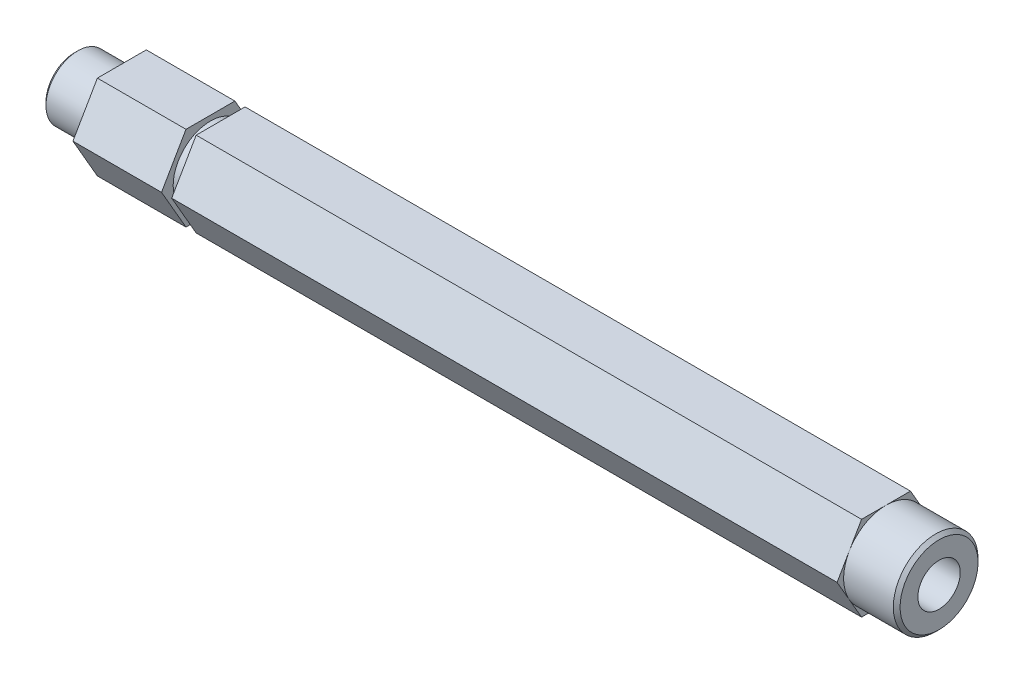
ISO-10303-21;
HEADER;
FILE_DESCRIPTION(('STEP AP214'),'2;1');
FILE_NAME('part.step','',(''),(''),'','','');
FILE_SCHEMA(('AUTOMOTIVE_DESIGN { 1 0 10303 214 1 1 1 1 }'));
ENDSEC;
DATA;
#1=APPLICATION_CONTEXT('core data for automotive mechanical design processes');
#2=APPLICATION_PROTOCOL_DEFINITION('international standard','automotive_design',2000,#1);
#3=PRODUCT_CONTEXT('',#1,'mechanical');
#4=PRODUCT('Part','Part','',(#3));
#5=PRODUCT_RELATED_PRODUCT_CATEGORY('part','',(#4));
#6=PRODUCT_DEFINITION_FORMATION('','',#4);
#7=PRODUCT_DEFINITION_CONTEXT('part definition',#1,'design');
#8=PRODUCT_DEFINITION('design','',#6,#7);
#9=PRODUCT_DEFINITION_SHAPE('','',#8);
#10=(LENGTH_UNIT() NAMED_UNIT(*) SI_UNIT(.MILLI.,.METRE.));
#11=(NAMED_UNIT(*) PLANE_ANGLE_UNIT() SI_UNIT($,.RADIAN.));
#12=(NAMED_UNIT(*) SI_UNIT($,.STERADIAN.) SOLID_ANGLE_UNIT());
#13=UNCERTAINTY_MEASURE_WITH_UNIT(LENGTH_MEASURE(1.E-05),#10,'distance_accuracy_value','');
#14=(GEOMETRIC_REPRESENTATION_CONTEXT(3) GLOBAL_UNCERTAINTY_ASSIGNED_CONTEXT((#13)) GLOBAL_UNIT_ASSIGNED_CONTEXT((#10,
#11,#12)) REPRESENTATION_CONTEXT('',''));
#15=CARTESIAN_POINT('',(0.,0.,0.));
#16=DIRECTION('',(0.,0.,1.));
#17=DIRECTION('',(1.,0.,0.));
#18=AXIS2_PLACEMENT_3D('',#15,#16,#17);
#19=CARTESIAN_POINT('',(-75.5502960638859,27.3174302940638,391.529415609775));
#20=DIRECTION('',(1.,0.,0.));
#21=DIRECTION('',(0.,-1.,0.));
#22=AXIS2_PLACEMENT_3D('',#19,#20,#21);
#23=PLANE('',#22);
#24=CARTESIAN_POINT('',(-75.5502960638859,27.3174302940638,391.529415609775));
#25=DIRECTION('',(1.,0.,0.));
#26=DIRECTION('',(0.,0.,1.));
#27=AXIS2_PLACEMENT_3D('',#24,#25,#26);
#28=CIRCLE('',#27,6.35);
#29=CARTESIAN_POINT('',(-75.5502960638859,24.1424302940638,397.028676923806));
#30=VERTEX_POINT('',#29);
#31=CARTESIAN_POINT('',(-75.5502960638859,20.9674302940638,391.529415609775));
#32=VERTEX_POINT('',#31);
#33=EDGE_CURVE('E447',#30,#32,#28,.T.);
#34=ORIENTED_EDGE('',*,*,#33,.F.);
#35=DIRECTION('',(0.,-0.866025403784439,-0.5));
#36=VECTOR('',#35,1.);
#37=CARTESIAN_POINT('',(-75.5502960638859,24.1424302940638,397.028676923806));
#38=LINE('',#37,#36);
#39=CARTESIAN_POINT('',(-75.5502960638859,20.9674302940638,395.195589819129));
#40=VERTEX_POINT('',#39);
#41=EDGE_CURVE('E266',#30,#40,#38,.T.);
#42=ORIENTED_EDGE('',*,*,#41,.T.);
#43=DIRECTION('',(0.,0.,-1.));
#44=VECTOR('',#43,1.);
#45=CARTESIAN_POINT('',(-75.5502960638859,20.9674302940638,391.529415609775));
#46=LINE('',#45,#44);
#47=EDGE_CURVE('E255',#40,#32,#46,.T.);
#48=ORIENTED_EDGE('',*,*,#47,.T.);
#49=EDGE_LOOP('',(#34,#42,#48));
#50=FACE_BOUND('',#49,.T.);
#51=ADVANCED_FACE('F17',(#50),#23,.T.);
#52=CARTESIAN_POINT('',(-75.5502960638859,27.3174302940638,391.529415609775));
#53=DIRECTION('',(1.,0.,0.));
#54=DIRECTION('',(0.,-1.,0.));
#55=AXIS2_PLACEMENT_3D('',#52,#53,#54);
#56=PLANE('',#55);
#57=CARTESIAN_POINT('',(-75.5502960638859,27.3174302940638,391.529415609775));
#58=DIRECTION('',(1.,0.,0.));
#59=DIRECTION('',(0.,0.,1.));
#60=AXIS2_PLACEMENT_3D('',#57,#58,#59);
#61=CIRCLE('',#60,6.35);
#62=CARTESIAN_POINT('',(-75.5502960638859,24.1424302940638,386.030154295744));
#63=VERTEX_POINT('',#62);
#64=EDGE_CURVE('E428',#32,#63,#61,.T.);
#65=ORIENTED_EDGE('',*,*,#64,.F.);
#66=DIRECTION('',(0.,0.,-1.));
#67=VECTOR('',#66,1.);
#68=CARTESIAN_POINT('',(-75.5502960638859,20.9674302940638,391.529415609775));
#69=LINE('',#68,#67);
#70=CARTESIAN_POINT('',(-75.5502960638859,20.9674302940638,387.863241400421));
#71=VERTEX_POINT('',#70);
#72=EDGE_CURVE('E252',#32,#71,#69,.T.);
#73=ORIENTED_EDGE('',*,*,#72,.T.);
#74=DIRECTION('',(0.,0.866025403784438,-0.5));
#75=VECTOR('',#74,1.);
#76=CARTESIAN_POINT('',(-75.5502960638859,24.1424302940638,386.030154295744));
#77=LINE('',#76,#75);
#78=EDGE_CURVE('E244',#71,#63,#77,.T.);
#79=ORIENTED_EDGE('',*,*,#78,.T.);
#80=EDGE_LOOP('',(#65,#73,#79));
#81=FACE_BOUND('',#80,.T.);
#82=ADVANCED_FACE('F19',(#81),#56,.T.);
#83=CARTESIAN_POINT('',(-75.5502960638859,27.3174302940638,391.529415609775));
#84=DIRECTION('',(1.,0.,0.));
#85=DIRECTION('',(0.,-1.,0.));
#86=AXIS2_PLACEMENT_3D('',#83,#84,#85);
#87=PLANE('',#86);
#88=CARTESIAN_POINT('',(-75.5502960638859,27.3174302940638,391.529415609775));
#89=DIRECTION('',(1.,0.,0.));
#90=DIRECTION('',(0.,0.,1.));
#91=AXIS2_PLACEMENT_3D('',#88,#89,#90);
#92=CIRCLE('',#91,6.35);
#93=CARTESIAN_POINT('',(-75.5502960638858,30.4924302940638,386.030154295744));
#94=VERTEX_POINT('',#93);
#95=EDGE_CURVE('E425',#63,#94,#92,.T.);
#96=ORIENTED_EDGE('',*,*,#95,.F.);
#97=DIRECTION('',(0.,0.866025403784438,-0.5));
#98=VECTOR('',#97,1.);
#99=CARTESIAN_POINT('',(-75.5502960638859,24.1424302940638,386.030154295744));
#100=LINE('',#99,#98);
#101=CARTESIAN_POINT('',(-75.5502960638859,27.3174302940638,384.197067191066));
#102=VERTEX_POINT('',#101);
#103=EDGE_CURVE('E242',#63,#102,#100,.T.);
#104=ORIENTED_EDGE('',*,*,#103,.T.);
#105=DIRECTION('',(0.,0.866025403784439,0.5));
#106=VECTOR('',#105,1.);
#107=CARTESIAN_POINT('',(-75.5502960638858,30.4924302940638,386.030154295744));
#108=LINE('',#107,#106);
#109=EDGE_CURVE('E371',#102,#94,#108,.T.);
#110=ORIENTED_EDGE('',*,*,#109,.T.);
#111=EDGE_LOOP('',(#96,#104,#110));
#112=FACE_BOUND('',#111,.T.);
#113=ADVANCED_FACE('F507',(#112),#87,.T.);
#114=CARTESIAN_POINT('',(-75.5502960638859,27.3174302940638,391.529415609775));
#115=DIRECTION('',(1.,0.,0.));
#116=DIRECTION('',(0.,-1.,0.));
#117=AXIS2_PLACEMENT_3D('',#114,#115,#116);
#118=PLANE('',#117);
#119=CARTESIAN_POINT('',(-75.5502960638859,27.3174302940638,391.529415609775));
#120=DIRECTION('',(1.,0.,0.));
#121=DIRECTION('',(0.,0.,1.));
#122=AXIS2_PLACEMENT_3D('',#119,#120,#121);
#123=CIRCLE('',#122,6.35);
#124=CARTESIAN_POINT('',(-75.5502960638858,33.6674302940638,391.529415609775));
#125=VERTEX_POINT('',#124);
#126=EDGE_CURVE('E407',#94,#125,#123,.T.);
#127=ORIENTED_EDGE('',*,*,#126,.F.);
#128=DIRECTION('',(0.,0.866025403784439,0.5));
#129=VECTOR('',#128,1.);
#130=CARTESIAN_POINT('',(-75.5502960638858,30.4924302940638,386.030154295744));
#131=LINE('',#130,#129);
#132=CARTESIAN_POINT('',(-75.5502960638858,33.6674302940638,387.863241400421));
#133=VERTEX_POINT('',#132);
#134=EDGE_CURVE('E370',#94,#133,#131,.T.);
#135=ORIENTED_EDGE('',*,*,#134,.T.);
#136=DIRECTION('',(0.,0.,1.));
#137=VECTOR('',#136,1.);
#138=CARTESIAN_POINT('',(-75.5502960638858,33.6674302940638,391.529415609775));
#139=LINE('',#138,#137);
#140=EDGE_CURVE('E352',#133,#125,#139,.T.);
#141=ORIENTED_EDGE('',*,*,#140,.T.);
#142=EDGE_LOOP('',(#127,#135,#141));
#143=FACE_BOUND('',#142,.T.);
#144=ADVANCED_FACE('F405',(#143),#118,.T.);
#145=CARTESIAN_POINT('',(-75.5502960638859,27.3174302940638,391.529415609775));
#146=DIRECTION('',(1.,0.,0.));
#147=DIRECTION('',(0.,-1.,0.));
#148=AXIS2_PLACEMENT_3D('',#145,#146,#147);
#149=PLANE('',#148);
#150=CARTESIAN_POINT('',(-75.5502960638859,27.3174302940638,391.529415609775));
#151=DIRECTION('',(1.,0.,0.));
#152=DIRECTION('',(0.,0.,1.));
#153=AXIS2_PLACEMENT_3D('',#150,#151,#152);
#154=CIRCLE('',#153,6.35);
#155=CARTESIAN_POINT('',(-75.5502960638858,30.4924302940639,397.028676923806));
#156=VERTEX_POINT('',#155);
#157=EDGE_CURVE('E430',#125,#156,#154,.T.);
#158=ORIENTED_EDGE('',*,*,#157,.F.);
#159=DIRECTION('',(0.,0.,1.));
#160=VECTOR('',#159,1.);
#161=CARTESIAN_POINT('',(-75.5502960638858,33.6674302940638,391.529415609775));
#162=LINE('',#161,#160);
#163=CARTESIAN_POINT('',(-75.5502960638858,33.6674302940638,395.195589819129));
#164=VERTEX_POINT('',#163);
#165=EDGE_CURVE('E362',#125,#164,#162,.T.);
#166=ORIENTED_EDGE('',*,*,#165,.T.);
#167=DIRECTION('',(0.,-0.866025403784438,0.5));
#168=VECTOR('',#167,1.);
#169=CARTESIAN_POINT('',(-75.5502960638858,30.4924302940639,397.028676923806));
#170=LINE('',#169,#168);
#171=EDGE_CURVE('E276',#164,#156,#170,.T.);
#172=ORIENTED_EDGE('',*,*,#171,.T.);
#173=EDGE_LOOP('',(#158,#166,#172));
#174=FACE_BOUND('',#173,.T.);
#175=ADVANCED_FACE('F568',(#174),#149,.T.);
#176=CARTESIAN_POINT('',(-176.820096063886,27.3174302940641,391.529415609775));
#177=DIRECTION('',(1.,0.,0.));
#178=DIRECTION('',(0.,-1.,0.));
#179=AXIS2_PLACEMENT_3D('',#176,#177,#178);
#180=PLANE('',#179);
#181=DIRECTION('',(0.,-0.866025403784438,0.5));
#182=VECTOR('',#181,1.);
#183=CARTESIAN_POINT('',(-176.820096063886,33.667430294064,395.195589819129));
#184=LINE('',#183,#182);
#185=CARTESIAN_POINT('',(-176.820096063886,33.667430294064,395.195589819129));
#186=VERTEX_POINT('',#185);
#187=CARTESIAN_POINT('',(-176.820096063886,27.3174302940641,398.861764028484));
#188=VERTEX_POINT('',#187);
#189=EDGE_CURVE('E26',#186,#188,#184,.T.);
#190=ORIENTED_EDGE('',*,*,#189,.T.);
#191=DIRECTION('',(0.,-0.866025403784439,-0.5));
#192=VECTOR('',#191,1.);
#193=CARTESIAN_POINT('',(-176.820096063886,27.3174302940641,398.861764028484));
#194=LINE('',#193,#192);
#195=CARTESIAN_POINT('',(-176.820096063886,20.967430294064,395.195589819129));
#196=VERTEX_POINT('',#195);
#197=EDGE_CURVE('E205',#188,#196,#194,.T.);
#198=ORIENTED_EDGE('',*,*,#197,.T.);
#199=DIRECTION('',(0.,0.,-1.));
#200=VECTOR('',#199,1.);
#201=CARTESIAN_POINT('',(-176.820096063886,20.967430294064,395.195589819129));
#202=LINE('',#201,#200);
#203=CARTESIAN_POINT('',(-176.820096063886,20.967430294064,387.863241400421));
#204=VERTEX_POINT('',#203);
#205=EDGE_CURVE('E210',#196,#204,#202,.T.);
#206=ORIENTED_EDGE('',*,*,#205,.T.);
#207=DIRECTION('',(0.,0.866025403784438,-0.5));
#208=VECTOR('',#207,1.);
#209=CARTESIAN_POINT('',(-176.820096063886,20.967430294064,387.863241400421));
#210=LINE('',#209,#208);
#211=CARTESIAN_POINT('',(-176.820096063886,27.317430294064,384.197067191067));
#212=VERTEX_POINT('',#211);
#213=EDGE_CURVE('E313',#204,#212,#210,.T.);
#214=ORIENTED_EDGE('',*,*,#213,.T.);
#215=DIRECTION('',(0.,0.866025403784439,0.5));
#216=VECTOR('',#215,1.);
#217=CARTESIAN_POINT('',(-176.820096063886,27.317430294064,384.197067191067));
#218=LINE('',#217,#216);
#219=CARTESIAN_POINT('',(-176.820096063886,33.667430294064,387.863241400421));
#220=VERTEX_POINT('',#219);
#221=EDGE_CURVE('E303',#212,#220,#218,.T.);
#222=ORIENTED_EDGE('',*,*,#221,.T.);
#223=DIRECTION('',(0.,0.,1.));
#224=VECTOR('',#223,1.);
#225=CARTESIAN_POINT('',(-176.820096063886,33.667430294064,387.863241400421));
#226=LINE('',#225,#224);
#227=EDGE_CURVE('E295',#220,#186,#226,.T.);
#228=ORIENTED_EDGE('',*,*,#227,.T.);
#229=EDGE_LOOP('',(#190,#198,#206,#214,#222,#228));
#230=FACE_BOUND('',#229,.T.);
#231=CARTESIAN_POINT('',(-176.820096063886,27.3174302940641,391.529415609775));
#232=DIRECTION('',(1.,0.,0.));
#233=DIRECTION('',(0.,0.,1.));
#234=AXIS2_PLACEMENT_3D('',#231,#232,#233);
#235=CIRCLE('',#234,5.588);
#236=CARTESIAN_POINT('',(-176.820096063886,27.3174302940641,397.117415609775));
#237=VERTEX_POINT('',#236);
#238=EDGE_CURVE('E282',#237,#237,#235,.T.);
#239=ORIENTED_EDGE('',*,*,#238,.F.);
#240=EDGE_LOOP('',(#239));
#241=FACE_BOUND('',#240,.T.);
#242=ADVANCED_FACE('F207',(#230,#241),#180,.T.);
#243=CARTESIAN_POINT('',(-190.104296063886,27.3174302940641,391.529415609775));
#244=DIRECTION('',(-1.,0.,0.));
#245=DIRECTION('',(0.,0.,-1.));
#246=AXIS2_PLACEMENT_3D('',#243,#244,#245);
#247=CYLINDRICAL_SURFACE('',#246,4.7625);
#248=CARTESIAN_POINT('',(-196.708296063886,27.3174302940641,391.529415609775));
#249=DIRECTION('',(1.,0.,0.));
#250=DIRECTION('',(0.,0.,1.));
#251=AXIS2_PLACEMENT_3D('',#248,#249,#250);
#252=CIRCLE('',#251,4.7625);
#253=CARTESIAN_POINT('',(-196.708296063886,27.3174302940641,396.291915609775));
#254=VERTEX_POINT('',#253);
#255=EDGE_CURVE('E589',#254,#254,#252,.T.);
#256=ORIENTED_EDGE('',*,*,#255,.T.);
#257=EDGE_LOOP('',(#256));
#258=FACE_BOUND('',#257,.T.);
#259=CARTESIAN_POINT('',(-190.104296063886,27.3174302940641,391.529415609775));
#260=DIRECTION('',(1.,0.,0.));
#261=DIRECTION('',(0.,0.,1.));
#262=AXIS2_PLACEMENT_3D('',#259,#260,#261);
#263=CIRCLE('',#262,4.7625);
#264=CARTESIAN_POINT('',(-190.104296063886,27.3174302940641,396.291915609775));
#265=VERTEX_POINT('',#264);
#266=EDGE_CURVE('E11',#265,#265,#263,.T.);
#267=ORIENTED_EDGE('',*,*,#266,.F.);
#268=EDGE_LOOP('',(#267));
#269=FACE_BOUND('',#268,.T.);
#270=ADVANCED_FACE('F557',(#258,#269),#247,.T.);
#271=CARTESIAN_POINT('',(-197.216296063886,27.3174302940641,391.529415609775));
#272=DIRECTION('',(1.,0.,0.));
#273=DIRECTION('',(0.,-1.,0.));
#274=AXIS2_PLACEMENT_3D('',#271,#272,#273);
#275=PLANE('',#274);
#276=CARTESIAN_POINT('',(-197.216296063886,27.3174302940641,391.529415609775));
#277=DIRECTION('',(-1.,0.,0.));
#278=DIRECTION('',(0.,0.,1.));
#279=AXIS2_PLACEMENT_3D('',#276,#277,#278);
#280=CIRCLE('',#279,4.2545);
#281=CARTESIAN_POINT('',(-197.216296063886,27.3174302940641,395.783915609775));
#282=VERTEX_POINT('',#281);
#283=EDGE_CURVE('E585',#282,#282,#280,.T.);
#284=ORIENTED_EDGE('',*,*,#283,.T.);
#285=EDGE_LOOP('',(#284));
#286=FACE_BOUND('',#285,.T.);
#287=CARTESIAN_POINT('',(-197.216296063886,27.3174302940641,391.529415609775));
#288=DIRECTION('',(-1.,0.,0.));
#289=DIRECTION('',(0.,0.,-1.));
#290=AXIS2_PLACEMENT_3D('',#287,#288,#289);
#291=CIRCLE('',#290,3.175);
#292=CARTESIAN_POINT('',(-197.216296063886,27.3174302940641,388.354415609775));
#293=VERTEX_POINT('',#292);
#294=EDGE_CURVE('E421',#293,#293,#291,.T.);
#295=ORIENTED_EDGE('',*,*,#294,.F.);
#296=EDGE_LOOP('',(#295));
#297=FACE_BOUND('',#296,.T.);
#298=ADVANCED_FACE('F554',(#286,#297),#275,.F.);
#299=CARTESIAN_POINT('',(-190.104296063886,27.3174302940641,391.529415609775));
#300=DIRECTION('',(1.,0.,0.));
#301=DIRECTION('',(0.,-1.,0.));
#302=AXIS2_PLACEMENT_3D('',#299,#300,#301);
#303=PLANE('',#302);
#304=DIRECTION('',(0.,-0.866025403784438,0.5));
#305=VECTOR('',#304,1.);
#306=CARTESIAN_POINT('',(-190.104296063886,33.6674302940641,395.195589819129));
#307=LINE('',#306,#305);
#308=CARTESIAN_POINT('',(-190.104296063886,33.6674302940641,395.195589819129));
#309=VERTEX_POINT('',#308);
#310=CARTESIAN_POINT('',(-190.104296063886,27.3174302940641,398.861764028484));
#311=VERTEX_POINT('',#310);
#312=EDGE_CURVE('E258',#309,#311,#307,.T.);
#313=ORIENTED_EDGE('',*,*,#312,.F.);
#314=DIRECTION('',(0.,0.,1.));
#315=VECTOR('',#314,1.);
#316=CARTESIAN_POINT('',(-190.104296063886,33.667430294064,387.863241400421));
#317=LINE('',#316,#315);
#318=CARTESIAN_POINT('',(-190.104296063886,33.667430294064,387.863241400421));
#319=VERTEX_POINT('',#318);
#320=EDGE_CURVE('E287',#319,#309,#317,.T.);
#321=ORIENTED_EDGE('',*,*,#320,.F.);
#322=DIRECTION('',(0.,0.866025403784439,0.5));
#323=VECTOR('',#322,1.);
#324=CARTESIAN_POINT('',(-190.104296063886,27.3174302940641,384.197067191067));
#325=LINE('',#324,#323);
#326=CARTESIAN_POINT('',(-190.104296063886,27.3174302940641,384.197067191067));
#327=VERTEX_POINT('',#326);
#328=EDGE_CURVE('E302',#327,#319,#325,.T.);
#329=ORIENTED_EDGE('',*,*,#328,.F.);
#330=DIRECTION('',(0.,0.866025403784438,-0.5));
#331=VECTOR('',#330,1.);
#332=CARTESIAN_POINT('',(-190.104296063886,20.967430294064,387.863241400421));
#333=LINE('',#332,#331);
#334=CARTESIAN_POINT('',(-190.104296063886,20.967430294064,387.863241400421));
#335=VERTEX_POINT('',#334);
#336=EDGE_CURVE('E310',#335,#327,#333,.T.);
#337=ORIENTED_EDGE('',*,*,#336,.F.);
#338=DIRECTION('',(0.,0.,-1.));
#339=VECTOR('',#338,1.);
#340=CARTESIAN_POINT('',(-190.104296063886,20.9674302940641,395.195589819129));
#341=LINE('',#340,#339);
#342=CARTESIAN_POINT('',(-190.104296063886,20.9674302940641,395.195589819129));
#343=VERTEX_POINT('',#342);
#344=EDGE_CURVE('E231',#343,#335,#341,.T.);
#345=ORIENTED_EDGE('',*,*,#344,.F.);
#346=DIRECTION('',(0.,-0.866025403784439,-0.5));
#347=VECTOR('',#346,1.);
#348=CARTESIAN_POINT('',(-190.104296063886,27.3174302940641,398.861764028484));
#349=LINE('',#348,#347);
#350=EDGE_CURVE('E216',#311,#343,#349,.T.);
#351=ORIENTED_EDGE('',*,*,#350,.F.);
#352=EDGE_LOOP('',(#313,#321,#329,#337,#345,#351));
#353=FACE_BOUND('',#352,.T.);
#354=ORIENTED_EDGE('',*,*,#266,.T.);
#355=EDGE_LOOP('',(#354));
#356=FACE_BOUND('',#355,.T.);
#357=ADVANCED_FACE('F326',(#353,#356),#303,.F.);
#358=CARTESIAN_POINT('',(-176.820096063886,33.667430294064,395.195589819129));
#359=DIRECTION('',(0.,-0.5,-0.866025403784438));
#360=DIRECTION('',(0.,-0.866025403784438,0.5));
#361=AXIS2_PLACEMENT_3D('',#358,#359,#360);
#362=PLANE('',#361);
#363=ORIENTED_EDGE('',*,*,#312,.T.);
#364=DIRECTION('',(-1.,0.,0.));
#365=VECTOR('',#364,1.);
#366=CARTESIAN_POINT('',(-176.820096063886,27.3174302940641,398.861764028484));
#367=LINE('',#366,#365);
#368=EDGE_CURVE('E215',#188,#311,#367,.T.);
#369=ORIENTED_EDGE('',*,*,#368,.F.);
#370=ORIENTED_EDGE('',*,*,#189,.F.);
#371=DIRECTION('',(-1.,0.,0.));
#372=VECTOR('',#371,1.);
#373=CARTESIAN_POINT('',(-176.820096063886,33.667430294064,395.195589819129));
#374=LINE('',#373,#372);
#375=EDGE_CURVE('E291',#186,#309,#374,.T.);
#376=ORIENTED_EDGE('',*,*,#375,.T.);
#377=EDGE_LOOP('',(#363,#369,#370,#376));
#378=FACE_BOUND('',#377,.T.);
#379=ADVANCED_FACE('F322',(#378),#362,.F.);
#380=CARTESIAN_POINT('',(-176.820096063886,27.3174302940641,398.861764028484));
#381=DIRECTION('',(0.,0.5,-0.866025403784439));
#382=DIRECTION('',(-1.,0.,0.));
#383=AXIS2_PLACEMENT_3D('',#380,#381,#382);
#384=PLANE('',#383);
#385=ORIENTED_EDGE('',*,*,#350,.T.);
#386=DIRECTION('',(-1.,0.,0.));
#387=VECTOR('',#386,1.);
#388=CARTESIAN_POINT('',(-176.820096063886,20.967430294064,395.195589819129));
#389=LINE('',#388,#387);
#390=EDGE_CURVE('E219',#196,#343,#389,.T.);
#391=ORIENTED_EDGE('',*,*,#390,.F.);
#392=ORIENTED_EDGE('',*,*,#197,.F.);
#393=ORIENTED_EDGE('',*,*,#368,.T.);
#394=EDGE_LOOP('',(#385,#391,#392,#393));
#395=FACE_BOUND('',#394,.T.);
#396=ADVANCED_FACE('F220',(#395),#384,.F.);
#397=CARTESIAN_POINT('',(-176.820096063886,20.967430294064,395.195589819129));
#398=DIRECTION('',(0.,1.,0.));
#399=DIRECTION('',(0.,0.,-1.));
#400=AXIS2_PLACEMENT_3D('',#397,#398,#399);
#401=PLANE('',#400);
#402=ORIENTED_EDGE('',*,*,#344,.T.);
#403=DIRECTION('',(-1.,0.,0.));
#404=VECTOR('',#403,1.);
#405=CARTESIAN_POINT('',(-176.820096063886,20.967430294064,387.863241400421));
#406=LINE('',#405,#404);
#407=EDGE_CURVE('E228',#204,#335,#406,.T.);
#408=ORIENTED_EDGE('',*,*,#407,.F.);
#409=ORIENTED_EDGE('',*,*,#205,.F.);
#410=ORIENTED_EDGE('',*,*,#390,.T.);
#411=EDGE_LOOP('',(#402,#408,#409,#410));
#412=FACE_BOUND('',#411,.T.);
#413=ADVANCED_FACE('F226',(#412),#401,.F.);
#414=CARTESIAN_POINT('',(-176.820096063886,20.967430294064,387.863241400421));
#415=DIRECTION('',(0.,0.5,0.866025403784438));
#416=DIRECTION('',(1.,0.,0.));
#417=AXIS2_PLACEMENT_3D('',#414,#415,#416);
#418=PLANE('',#417);
#419=ORIENTED_EDGE('',*,*,#336,.T.);
#420=DIRECTION('',(-1.,0.,0.));
#421=VECTOR('',#420,1.);
#422=CARTESIAN_POINT('',(-176.820096063886,27.317430294064,384.197067191067));
#423=LINE('',#422,#421);
#424=EDGE_CURVE('E306',#212,#327,#423,.T.);
#425=ORIENTED_EDGE('',*,*,#424,.F.);
#426=ORIENTED_EDGE('',*,*,#213,.F.);
#427=ORIENTED_EDGE('',*,*,#407,.T.);
#428=EDGE_LOOP('',(#419,#425,#426,#427));
#429=FACE_BOUND('',#428,.T.);
#430=ADVANCED_FACE('F330',(#429),#418,.F.);
#431=CARTESIAN_POINT('',(-176.820096063886,27.317430294064,384.197067191067));
#432=DIRECTION('',(0.,-0.5,0.866025403784439));
#433=DIRECTION('',(-1.,0.,0.));
#434=AXIS2_PLACEMENT_3D('',#431,#432,#433);
#435=PLANE('',#434);
#436=ORIENTED_EDGE('',*,*,#328,.T.);
#437=DIRECTION('',(-1.,0.,0.));
#438=VECTOR('',#437,1.);
#439=CARTESIAN_POINT('',(-176.820096063886,33.667430294064,387.863241400421));
#440=LINE('',#439,#438);
#441=EDGE_CURVE('E298',#220,#319,#440,.T.);
#442=ORIENTED_EDGE('',*,*,#441,.F.);
#443=ORIENTED_EDGE('',*,*,#221,.F.);
#444=ORIENTED_EDGE('',*,*,#424,.T.);
#445=EDGE_LOOP('',(#436,#442,#443,#444));
#446=FACE_BOUND('',#445,.T.);
#447=ADVANCED_FACE('F336',(#446),#435,.F.);
#448=CARTESIAN_POINT('',(-176.820096063886,33.667430294064,387.863241400421));
#449=DIRECTION('',(0.,-1.,0.));
#450=DIRECTION('',(-1.,0.,0.));
#451=AXIS2_PLACEMENT_3D('',#448,#449,#450);
#452=PLANE('',#451);
#453=ORIENTED_EDGE('',*,*,#320,.T.);
#454=ORIENTED_EDGE('',*,*,#375,.F.);
#455=ORIENTED_EDGE('',*,*,#227,.F.);
#456=ORIENTED_EDGE('',*,*,#441,.T.);
#457=EDGE_LOOP('',(#453,#454,#455,#456));
#458=FACE_BOUND('',#457,.T.);
#459=ADVANCED_FACE('F338',(#458),#452,.F.);
#460=CARTESIAN_POINT('',(-175.296096063886,27.3174302940641,391.529415609775));
#461=DIRECTION('',(-1.,0.,0.));
#462=DIRECTION('',(0.,0.,-1.));
#463=AXIS2_PLACEMENT_3D('',#460,#461,#462);
#464=CYLINDRICAL_SURFACE('',#463,5.588);
#465=CARTESIAN_POINT('',(-175.296096063886,27.3174302940641,391.529415609775));
#466=DIRECTION('',(1.,0.,0.));
#467=DIRECTION('',(0.,0.,1.));
#468=AXIS2_PLACEMENT_3D('',#465,#466,#467);
#469=CIRCLE('',#468,5.588);
#470=CARTESIAN_POINT('',(-175.296096063886,27.3174302940641,397.117415609775));
#471=VERTEX_POINT('',#470);
#472=EDGE_CURVE('E279',#471,#471,#469,.T.);
#473=ORIENTED_EDGE('',*,*,#472,.F.);
#474=EDGE_LOOP('',(#473));
#475=FACE_BOUND('',#474,.T.);
#476=ORIENTED_EDGE('',*,*,#238,.T.);
#477=EDGE_LOOP('',(#476));
#478=FACE_BOUND('',#477,.T.);
#479=ADVANCED_FACE('F534',(#475,#478),#464,.T.);
#480=CARTESIAN_POINT('',(-175.296096063886,27.3174302940641,391.529415609775));
#481=DIRECTION('',(1.,0.,0.));
#482=DIRECTION('',(0.,-1.,0.));
#483=AXIS2_PLACEMENT_3D('',#480,#481,#482);
#484=PLANE('',#483);
#485=DIRECTION('',(0.,-0.866025403784438,0.5));
#486=VECTOR('',#485,1.);
#487=CARTESIAN_POINT('',(-175.296096063886,33.667430294064,395.195589819129));
#488=LINE('',#487,#486);
#489=CARTESIAN_POINT('',(-175.296096063886,33.667430294064,395.195589819129));
#490=VERTEX_POINT('',#489);
#491=CARTESIAN_POINT('',(-175.296096063886,27.3174302940641,398.861764028484));
#492=VERTEX_POINT('',#491);
#493=EDGE_CURVE('E273',#490,#492,#488,.T.);
#494=ORIENTED_EDGE('',*,*,#493,.F.);
#495=DIRECTION('',(0.,0.,1.));
#496=VECTOR('',#495,1.);
#497=CARTESIAN_POINT('',(-175.296096063886,33.667430294064,387.863241400421));
#498=LINE('',#497,#496);
#499=CARTESIAN_POINT('',(-175.296096063886,33.667430294064,387.863241400421));
#500=VERTEX_POINT('',#499);
#501=EDGE_CURVE('E353',#500,#490,#498,.T.);
#502=ORIENTED_EDGE('',*,*,#501,.F.);
#503=DIRECTION('',(0.,0.866025403784439,0.5));
#504=VECTOR('',#503,1.);
#505=CARTESIAN_POINT('',(-175.296096063886,27.317430294064,384.197067191067));
#506=LINE('',#505,#504);
#507=CARTESIAN_POINT('',(-175.296096063886,27.3174302940641,384.197067191067));
#508=VERTEX_POINT('',#507);
#509=EDGE_CURVE('E351',#508,#500,#506,.T.);
#510=ORIENTED_EDGE('',*,*,#509,.F.);
#511=DIRECTION('',(0.,0.866025403784438,-0.5));
#512=VECTOR('',#511,1.);
#513=CARTESIAN_POINT('',(-175.296096063886,20.967430294064,387.863241400421));
#514=LINE('',#513,#512);
#515=CARTESIAN_POINT('',(-175.296096063886,20.967430294064,387.863241400421));
#516=VERTEX_POINT('',#515);
#517=EDGE_CURVE('E240',#516,#508,#514,.T.);
#518=ORIENTED_EDGE('',*,*,#517,.F.);
#519=DIRECTION('',(0.,0.,-1.));
#520=VECTOR('',#519,1.);
#521=CARTESIAN_POINT('',(-175.296096063886,20.967430294064,395.195589819129));
#522=LINE('',#521,#520);
#523=CARTESIAN_POINT('',(-175.296096063886,20.967430294064,395.195589819129));
#524=VERTEX_POINT('',#523);
#525=EDGE_CURVE('E251',#524,#516,#522,.T.);
#526=ORIENTED_EDGE('',*,*,#525,.F.);
#527=DIRECTION('',(0.,-0.866025403784439,-0.5));
#528=VECTOR('',#527,1.);
#529=CARTESIAN_POINT('',(-175.296096063886,27.3174302940641,398.861764028484));
#530=LINE('',#529,#528);
#531=EDGE_CURVE('E263',#492,#524,#530,.T.);
#532=ORIENTED_EDGE('',*,*,#531,.F.);
#533=EDGE_LOOP('',(#494,#502,#510,#518,#526,#532));
#534=FACE_BOUND('',#533,.T.);
#535=ORIENTED_EDGE('',*,*,#472,.T.);
#536=EDGE_LOOP('',(#535));
#537=FACE_BOUND('',#536,.T.);
#538=ADVANCED_FACE('F390',(#534,#537),#484,.F.);
#539=CARTESIAN_POINT('',(-176.820096063886,33.667430294064,395.195589819129));
#540=DIRECTION('',(0.,-0.5,-0.866025403784438));
#541=DIRECTION('',(0.,-0.866025403784438,0.5));
#542=AXIS2_PLACEMENT_3D('',#539,#540,#541);
#543=PLANE('',#542);
#544=ORIENTED_EDGE('',*,*,#493,.T.);
#545=DIRECTION('',(-1.,0.,0.));
#546=VECTOR('',#545,1.);
#547=CARTESIAN_POINT('',(-176.820096063886,27.3174302940641,398.861764028484));
#548=LINE('',#547,#546);
#549=CARTESIAN_POINT('',(-75.5502960638858,27.3174302940638,398.861764028483));
#550=VERTEX_POINT('',#549);
#551=EDGE_CURVE('E269',#550,#492,#548,.T.);
#552=ORIENTED_EDGE('',*,*,#551,.F.);
#553=DIRECTION('',(0.,-0.866025403784438,0.5));
#554=VECTOR('',#553,1.);
#555=CARTESIAN_POINT('',(-75.5502960638858,30.4924302940639,397.028676923806));
#556=LINE('',#555,#554);
#557=EDGE_CURVE('E418',#156,#550,#556,.T.);
#558=ORIENTED_EDGE('',*,*,#557,.F.);
#559=ORIENTED_EDGE('',*,*,#171,.F.);
#560=DIRECTION('',(-1.,0.,0.));
#561=VECTOR('',#560,1.);
#562=CARTESIAN_POINT('',(-176.820096063886,33.667430294064,395.195589819129));
#563=LINE('',#562,#561);
#564=EDGE_CURVE('E357',#164,#490,#563,.T.);
#565=ORIENTED_EDGE('',*,*,#564,.T.);
#566=EDGE_LOOP('',(#544,#552,#558,#559,#565));
#567=FACE_BOUND('',#566,.T.);
#568=ADVANCED_FACE('F524',(#567),#543,.F.);
#569=CARTESIAN_POINT('',(-176.820096063886,27.3174302940641,398.861764028484));
#570=DIRECTION('',(0.,0.5,-0.866025403784439));
#571=DIRECTION('',(-1.,0.,0.));
#572=AXIS2_PLACEMENT_3D('',#569,#570,#571);
#573=PLANE('',#572);
#574=ORIENTED_EDGE('',*,*,#531,.T.);
#575=DIRECTION('',(-1.,0.,0.));
#576=VECTOR('',#575,1.);
#577=CARTESIAN_POINT('',(-176.820096063886,20.967430294064,395.195589819129));
#578=LINE('',#577,#576);
#579=EDGE_CURVE('E259',#40,#524,#578,.T.);
#580=ORIENTED_EDGE('',*,*,#579,.F.);
#581=ORIENTED_EDGE('',*,*,#41,.F.);
#582=DIRECTION('',(0.,-0.866025403784439,-0.5));
#583=VECTOR('',#582,1.);
#584=CARTESIAN_POINT('',(-75.5502960638859,24.1424302940638,397.028676923806));
#585=LINE('',#584,#583);
#586=EDGE_CURVE('E358',#550,#30,#585,.T.);
#587=ORIENTED_EDGE('',*,*,#586,.F.);
#588=ORIENTED_EDGE('',*,*,#551,.T.);
#589=EDGE_LOOP('',(#574,#580,#581,#587,#588));
#590=FACE_BOUND('',#589,.T.);
#591=ADVANCED_FACE('F522',(#590),#573,.F.);
#592=CARTESIAN_POINT('',(-176.820096063886,20.967430294064,395.195589819129));
#593=DIRECTION('',(0.,1.,0.));
#594=DIRECTION('',(0.,0.,-1.));
#595=AXIS2_PLACEMENT_3D('',#592,#593,#594);
#596=PLANE('',#595);
#597=ORIENTED_EDGE('',*,*,#525,.T.);
#598=DIRECTION('',(-1.,0.,0.));
#599=VECTOR('',#598,1.);
#600=CARTESIAN_POINT('',(-176.820096063886,20.967430294064,387.863241400421));
#601=LINE('',#600,#599);
#602=EDGE_CURVE('E247',#71,#516,#601,.T.);
#603=ORIENTED_EDGE('',*,*,#602,.F.);
#604=ORIENTED_EDGE('',*,*,#72,.F.);
#605=ORIENTED_EDGE('',*,*,#47,.F.);
#606=ORIENTED_EDGE('',*,*,#579,.T.);
#607=EDGE_LOOP('',(#597,#603,#604,#605,#606));
#608=FACE_BOUND('',#607,.T.);
#609=ADVANCED_FACE('F516',(#608),#596,.F.);
#610=CARTESIAN_POINT('',(-176.820096063886,20.967430294064,387.863241400421));
#611=DIRECTION('',(0.,0.5,0.866025403784438));
#612=DIRECTION('',(1.,0.,0.));
#613=AXIS2_PLACEMENT_3D('',#610,#611,#612);
#614=PLANE('',#613);
#615=ORIENTED_EDGE('',*,*,#517,.T.);
#616=DIRECTION('',(-1.,0.,0.));
#617=VECTOR('',#616,1.);
#618=CARTESIAN_POINT('',(-176.820096063886,27.317430294064,384.197067191067));
#619=LINE('',#618,#617);
#620=EDGE_CURVE('E373',#102,#508,#619,.T.);
#621=ORIENTED_EDGE('',*,*,#620,.F.);
#622=ORIENTED_EDGE('',*,*,#103,.F.);
#623=ORIENTED_EDGE('',*,*,#78,.F.);
#624=ORIENTED_EDGE('',*,*,#602,.T.);
#625=EDGE_LOOP('',(#615,#621,#622,#623,#624));
#626=FACE_BOUND('',#625,.T.);
#627=ADVANCED_FACE('F384',(#626),#614,.F.);
#628=CARTESIAN_POINT('',(-176.820096063886,27.317430294064,384.197067191067));
#629=DIRECTION('',(0.,-0.5,0.866025403784439));
#630=DIRECTION('',(-1.,0.,0.));
#631=AXIS2_PLACEMENT_3D('',#628,#629,#630);
#632=PLANE('',#631);
#633=ORIENTED_EDGE('',*,*,#509,.T.);
#634=DIRECTION('',(-1.,0.,0.));
#635=VECTOR('',#634,1.);
#636=CARTESIAN_POINT('',(-176.820096063886,33.667430294064,387.863241400421));
#637=LINE('',#636,#635);
#638=EDGE_CURVE('E348',#133,#500,#637,.T.);
#639=ORIENTED_EDGE('',*,*,#638,.F.);
#640=ORIENTED_EDGE('',*,*,#134,.F.);
#641=ORIENTED_EDGE('',*,*,#109,.F.);
#642=ORIENTED_EDGE('',*,*,#620,.T.);
#643=EDGE_LOOP('',(#633,#639,#640,#641,#642));
#644=FACE_BOUND('',#643,.T.);
#645=ADVANCED_FACE('F395',(#644),#632,.F.);
#646=CARTESIAN_POINT('',(-176.820096063886,33.667430294064,387.863241400421));
#647=DIRECTION('',(0.,-1.,0.));
#648=DIRECTION('',(-1.,0.,0.));
#649=AXIS2_PLACEMENT_3D('',#646,#647,#648);
#650=PLANE('',#649);
#651=ORIENTED_EDGE('',*,*,#501,.T.);
#652=ORIENTED_EDGE('',*,*,#564,.F.);
#653=ORIENTED_EDGE('',*,*,#165,.F.);
#654=ORIENTED_EDGE('',*,*,#140,.F.);
#655=ORIENTED_EDGE('',*,*,#638,.T.);
#656=EDGE_LOOP('',(#651,#652,#653,#654,#655));
#657=FACE_BOUND('',#656,.T.);
#658=ADVANCED_FACE('F399',(#657),#650,.F.);
#659=CARTESIAN_POINT('',(-75.5502960638859,27.3174302940638,391.529415609775));
#660=DIRECTION('',(1.,0.,0.));
#661=DIRECTION('',(0.,-1.,0.));
#662=AXIS2_PLACEMENT_3D('',#659,#660,#661);
#663=PLANE('',#662);
#664=CARTESIAN_POINT('',(-75.5502960638859,27.3174302940638,391.529415609775));
#665=DIRECTION('',(1.,0.,0.));
#666=DIRECTION('',(0.,0.,1.));
#667=AXIS2_PLACEMENT_3D('',#664,#665,#666);
#668=CIRCLE('',#667,6.35);
#669=EDGE_CURVE('E346',#156,#30,#668,.T.);
#670=ORIENTED_EDGE('',*,*,#669,.F.);
#671=ORIENTED_EDGE('',*,*,#557,.T.);
#672=ORIENTED_EDGE('',*,*,#586,.T.);
#673=EDGE_LOOP('',(#670,#671,#672));
#674=FACE_BOUND('',#673,.T.);
#675=ADVANCED_FACE('F438',(#674),#663,.T.);
#676=CARTESIAN_POINT('',(-67.6000960638859,27.3174302940638,391.529415609775));
#677=DIRECTION('',(-1.,0.,0.));
#678=DIRECTION('',(0.,0.,-1.));
#679=AXIS2_PLACEMENT_3D('',#676,#677,#678);
#680=CYLINDRICAL_SURFACE('',#679,6.35);
#681=CARTESIAN_POINT('',(-68.1080960638859,27.3174302940638,391.529415609775));
#682=DIRECTION('',(-1.,0.,0.));
#683=DIRECTION('',(0.,0.,1.));
#684=AXIS2_PLACEMENT_3D('',#681,#682,#683);
#685=CIRCLE('',#684,6.35);
#686=CARTESIAN_POINT('',(-68.1080960638859,27.3174302940638,397.879415609775));
#687=VERTEX_POINT('',#686);
#688=EDGE_CURVE('E461',#687,#687,#685,.T.);
#689=ORIENTED_EDGE('',*,*,#688,.T.);
#690=EDGE_LOOP('',(#689));
#691=FACE_BOUND('',#690,.T.);
#692=ORIENTED_EDGE('',*,*,#33,.T.);
#693=ORIENTED_EDGE('',*,*,#64,.T.);
#694=ORIENTED_EDGE('',*,*,#95,.T.);
#695=ORIENTED_EDGE('',*,*,#126,.T.);
#696=ORIENTED_EDGE('',*,*,#157,.T.);
#697=ORIENTED_EDGE('',*,*,#669,.T.);
#698=EDGE_LOOP('',(#692,#693,#694,#695,#696,#697));
#699=FACE_BOUND('',#698,.T.);
#700=ADVANCED_FACE('F445',(#691,#699),#680,.T.);
#701=CARTESIAN_POINT('',(-67.6000960638859,27.3174302940638,391.529415609775));
#702=DIRECTION('',(1.,0.,0.));
#703=DIRECTION('',(0.,-1.,0.));
#704=AXIS2_PLACEMENT_3D('',#701,#702,#703);
#705=PLANE('',#704);
#706=CARTESIAN_POINT('',(-67.6000960638859,27.3174302940638,391.529415609775));
#707=DIRECTION('',(1.,0.,0.));
#708=DIRECTION('',(0.,0.,1.));
#709=AXIS2_PLACEMENT_3D('',#706,#707,#708);
#710=CIRCLE('',#709,5.842);
#711=CARTESIAN_POINT('',(-67.6000960638859,27.3174302940638,397.371415609775));
#712=VERTEX_POINT('',#711);
#713=EDGE_CURVE('E586',#712,#712,#710,.T.);
#714=ORIENTED_EDGE('',*,*,#713,.T.);
#715=EDGE_LOOP('',(#714));
#716=FACE_BOUND('',#715,.T.);
#717=CARTESIAN_POINT('',(-67.6000960638859,27.3174302940638,391.529415609775));
#718=DIRECTION('',(1.,0.,0.));
#719=DIRECTION('',(0.,0.,1.));
#720=AXIS2_PLACEMENT_3D('',#717,#718,#719);
#721=CIRCLE('',#720,3.175);
#722=CARTESIAN_POINT('',(-67.6000960638859,27.3174302940638,394.704415609775));
#723=VERTEX_POINT('',#722);
#724=EDGE_CURVE('E464',#723,#723,#721,.T.);
#725=ORIENTED_EDGE('',*,*,#724,.F.);
#726=EDGE_LOOP('',(#725));
#727=FACE_BOUND('',#726,.T.);
#728=ADVANCED_FACE('F486',(#716,#727),#705,.T.);
#729=CARTESIAN_POINT('',(-184.516296063886,27.3174302940641,391.529415609775));
#730=DIRECTION('',(-1.,0.,0.));
#731=DIRECTION('',(0.,0.,-1.));
#732=AXIS2_PLACEMENT_3D('',#729,#730,#731);
#733=CONICAL_SURFACE('',#732,3.175,1.02974425867665);
#734=CARTESIAN_POINT('',(-184.516296063886,27.3174302940641,391.529415609775));
#735=DIRECTION('',(-1.,0.,0.));
#736=DIRECTION('',(0.,0.,-1.));
#737=AXIS2_PLACEMENT_3D('',#734,#735,#736);
#738=CIRCLE('',#737,3.175);
#739=CARTESIAN_POINT('',(-184.516296063886,27.317430294064,388.354415609775));
#740=VERTEX_POINT('',#739);
#741=EDGE_CURVE('E424',#740,#740,#738,.T.);
#742=ORIENTED_EDGE('',*,*,#741,.T.);
#743=EDGE_LOOP('',(#742));
#744=FACE_BOUND('',#743,.T.);
#745=CARTESIAN_POINT('',(-182.608563598473,27.3174302940641,391.529415609775));
#746=VERTEX_POINT('',#745);
#747=VERTEX_LOOP('',#746);
#748=FACE_BOUND('',#747,.T.);
#749=ADVANCED_FACE('F488',(#744,#748),#733,.F.);
#750=CARTESIAN_POINT('',(-197.216296063886,27.3174302940641,391.529415609775));
#751=DIRECTION('',(-1.,0.,0.));
#752=DIRECTION('',(0.,0.,-1.));
#753=AXIS2_PLACEMENT_3D('',#750,#751,#752);
#754=CYLINDRICAL_SURFACE('',#753,3.175);
#755=ORIENTED_EDGE('',*,*,#741,.F.);
#756=EDGE_LOOP('',(#755));
#757=FACE_BOUND('',#756,.T.);
#758=ORIENTED_EDGE('',*,*,#294,.T.);
#759=EDGE_LOOP('',(#758));
#760=FACE_BOUND('',#759,.T.);
#761=ADVANCED_FACE('F496',(#757,#760),#754,.F.);
#762=CARTESIAN_POINT('',(-80.3000960638859,27.3174302940638,391.529415609775));
#763=DIRECTION('',(1.,0.,0.));
#764=DIRECTION('',(0.,0.,1.));
#765=AXIS2_PLACEMENT_3D('',#762,#763,#764);
#766=CONICAL_SURFACE('',#765,3.175,1.02974425867665);
#767=CARTESIAN_POINT('',(-80.3000960638859,27.3174302940638,391.529415609775));
#768=DIRECTION('',(1.,0.,0.));
#769=DIRECTION('',(0.,0.,1.));
#770=AXIS2_PLACEMENT_3D('',#767,#768,#769);
#771=CIRCLE('',#770,3.175);
#772=CARTESIAN_POINT('',(-80.3000960638859,27.3174302940638,394.704415609775));
#773=VERTEX_POINT('',#772);
#774=EDGE_CURVE('E416',#773,#773,#771,.T.);
#775=ORIENTED_EDGE('',*,*,#774,.T.);
#776=EDGE_LOOP('',(#775));
#777=FACE_BOUND('',#776,.T.);
#778=CARTESIAN_POINT('',(-82.2078285292985,27.3174302940638,391.529415609775));
#779=VERTEX_POINT('',#778);
#780=VERTEX_LOOP('',#779);
#781=FACE_BOUND('',#780,.T.);
#782=ADVANCED_FACE('F476',(#777,#781),#766,.F.);
#783=CARTESIAN_POINT('',(-197.216296063886,27.3174302940641,391.529415609775));
#784=DIRECTION('',(-1.,0.,0.));
#785=DIRECTION('',(0.,0.,-1.));
#786=AXIS2_PLACEMENT_3D('',#783,#784,#785);
#787=CYLINDRICAL_SURFACE('',#786,3.175);
#788=ORIENTED_EDGE('',*,*,#774,.F.);
#789=EDGE_LOOP('',(#788));
#790=FACE_BOUND('',#789,.T.);
#791=ORIENTED_EDGE('',*,*,#724,.T.);
#792=EDGE_LOOP('',(#791));
#793=FACE_BOUND('',#792,.T.);
#794=ADVANCED_FACE('F479',(#790,#793),#787,.F.);
#795=CARTESIAN_POINT('',(-67.6000960638859,27.3174302940638,391.529415609775));
#796=DIRECTION('',(-1.,0.,0.));
#797=DIRECTION('',(0.,0.,-1.));
#798=AXIS2_PLACEMENT_3D('',#795,#796,#797);
#799=CONICAL_SURFACE('',#798,5.842,0.785398163397452);
#800=ORIENTED_EDGE('',*,*,#688,.F.);
#801=EDGE_LOOP('',(#800));
#802=FACE_BOUND('',#801,.T.);
#803=ORIENTED_EDGE('',*,*,#713,.F.);
#804=EDGE_LOOP('',(#803));
#805=FACE_BOUND('',#804,.T.);
#806=ADVANCED_FACE('F482',(#802,#805),#799,.T.);
#807=CARTESIAN_POINT('',(-196.708296063886,27.3174302940641,391.529415609775));
#808=DIRECTION('',(1.,0.,0.));
#809=DIRECTION('',(0.,0.,1.));
#810=AXIS2_PLACEMENT_3D('',#807,#808,#809);
#811=CONICAL_SURFACE('',#810,4.7625,0.785398163397452);
#812=ORIENTED_EDGE('',*,*,#283,.F.);
#813=EDGE_LOOP('',(#812));
#814=FACE_BOUND('',#813,.T.);
#815=ORIENTED_EDGE('',*,*,#255,.F.);
#816=EDGE_LOOP('',(#815));
#817=FACE_BOUND('',#816,.T.);
#818=ADVANCED_FACE('F511',(#814,#817),#811,.T.);
#819=CLOSED_SHELL('',(#51,#82,#113,#144,#175,#242,#270,#298,#357,#379,#396,#413,#430,#447,#459,
#479,#538,#568,#591,#609,#627,#645,#658,#675,#700,#728,#749,#761,#782,#794,#806,#818));
#820=MANIFOLD_SOLID_BREP('B1',#819);
#821=ADVANCED_BREP_SHAPE_REPRESENTATION('',(#18,#820),#14);
#822=SHAPE_DEFINITION_REPRESENTATION(#9,#821);
ENDSEC;
END-ISO-10303-21;
